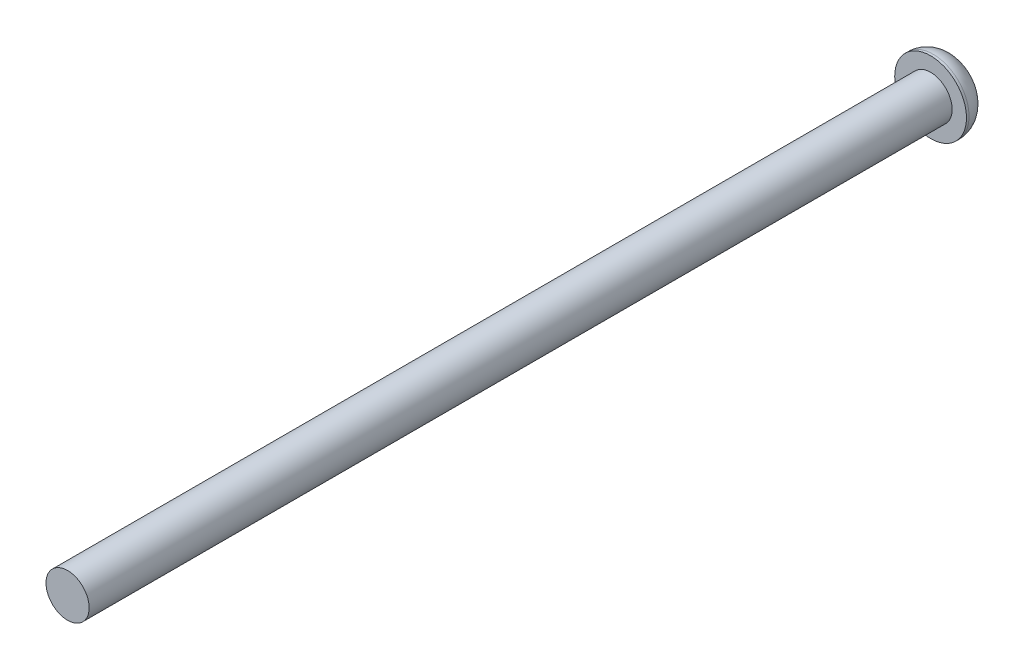
ISO-10303-21;
HEADER;
FILE_DESCRIPTION(('STEP AP214'),'2;1');
FILE_NAME('part.step','',(''),(''),'','','');
FILE_SCHEMA(('AUTOMOTIVE_DESIGN { 1 0 10303 214 1 1 1 1 }'));
ENDSEC;
DATA;
#1=APPLICATION_CONTEXT('core data for automotive mechanical design processes');
#2=APPLICATION_PROTOCOL_DEFINITION('international standard','automotive_design',2000,#1);
#3=PRODUCT_CONTEXT('',#1,'mechanical');
#4=PRODUCT('Part','Part','',(#3));
#5=PRODUCT_RELATED_PRODUCT_CATEGORY('part','',(#4));
#6=PRODUCT_DEFINITION_FORMATION('','',#4);
#7=PRODUCT_DEFINITION_CONTEXT('part definition',#1,'design');
#8=PRODUCT_DEFINITION('design','',#6,#7);
#9=PRODUCT_DEFINITION_SHAPE('','',#8);
#10=(LENGTH_UNIT() NAMED_UNIT(*) SI_UNIT(.MILLI.,.METRE.));
#11=(NAMED_UNIT(*) PLANE_ANGLE_UNIT() SI_UNIT($,.RADIAN.));
#12=(NAMED_UNIT(*) SI_UNIT($,.STERADIAN.) SOLID_ANGLE_UNIT());
#13=UNCERTAINTY_MEASURE_WITH_UNIT(LENGTH_MEASURE(1.E-05),#10,'distance_accuracy_value','');
#14=(GEOMETRIC_REPRESENTATION_CONTEXT(3) GLOBAL_UNCERTAINTY_ASSIGNED_CONTEXT((#13)) GLOBAL_UNIT_ASSIGNED_CONTEXT((#10,
#11,#12)) REPRESENTATION_CONTEXT('',''));
#15=CARTESIAN_POINT('',(0.,0.,0.));
#16=DIRECTION('',(0.,0.,1.));
#17=DIRECTION('',(1.,0.,0.));
#18=AXIS2_PLACEMENT_3D('',#15,#16,#17);
#19=CARTESIAN_POINT('',(0.,0.,100.));
#20=DIRECTION('',(0.,0.,-1.));
#21=DIRECTION('',(-1.,0.,0.));
#22=AXIS2_PLACEMENT_3D('',#19,#20,#21);
#23=CYLINDRICAL_SURFACE('',#22,2.5);
#24=CARTESIAN_POINT('',(0.,0.,100.));
#25=DIRECTION('',(0.,0.,1.));
#26=DIRECTION('',(1.,0.,0.));
#27=AXIS2_PLACEMENT_3D('',#24,#25,#26);
#28=CIRCLE('',#27,2.5);
#29=CARTESIAN_POINT('',(2.5,0.,100.));
#30=VERTEX_POINT('',#29);
#31=EDGE_CURVE('E146',#30,#30,#28,.T.);
#32=ORIENTED_EDGE('',*,*,#31,.F.);
#33=EDGE_LOOP('',(#32));
#34=FACE_BOUND('',#33,.T.);
#35=CARTESIAN_POINT('',(0.,0.,0.));
#36=DIRECTION('',(0.,0.,-1.));
#37=DIRECTION('',(-1.,0.,0.));
#38=AXIS2_PLACEMENT_3D('',#35,#36,#37);
#39=CIRCLE('',#38,2.5);
#40=CARTESIAN_POINT('',(-2.5,0.,0.));
#41=VERTEX_POINT('',#40);
#42=EDGE_CURVE('E143',#41,#41,#39,.T.);
#43=ORIENTED_EDGE('',*,*,#42,.F.);
#44=EDGE_LOOP('',(#43));
#45=FACE_BOUND('',#44,.T.);
#46=ADVANCED_FACE('F33',(#34,#45),#23,.T.);
#47=CARTESIAN_POINT('',(0.,0.,100.));
#48=DIRECTION('',(0.,0.,1.));
#49=DIRECTION('',(1.,0.,0.));
#50=AXIS2_PLACEMENT_3D('',#47,#48,#49);
#51=PLANE('',#50);
#52=ORIENTED_EDGE('',*,*,#31,.T.);
#53=EDGE_LOOP('',(#52));
#54=FACE_BOUND('',#53,.T.);
#55=ADVANCED_FACE('F167',(#54),#51,.T.);
#56=CARTESIAN_POINT('',(0.,0.,0.));
#57=DIRECTION('',(0.,0.,-1.));
#58=DIRECTION('',(-1.,0.,0.));
#59=AXIS2_PLACEMENT_3D('',#56,#57,#58);
#60=PLANE('',#59);
#61=CARTESIAN_POINT('',(0.,0.,0.));
#62=DIRECTION('',(0.,0.,-1.));
#63=DIRECTION('',(-1.,0.,0.));
#64=AXIS2_PLACEMENT_3D('',#61,#62,#63);
#65=CIRCLE('',#64,4.15958487677486);
#66=CARTESIAN_POINT('',(-4.15958487677486,0.,0.));
#67=VERTEX_POINT('',#66);
#68=EDGE_CURVE('E135',#67,#67,#65,.T.);
#69=ORIENTED_EDGE('',*,*,#68,.F.);
#70=EDGE_LOOP('',(#69));
#71=FACE_BOUND('',#70,.T.);
#72=ORIENTED_EDGE('',*,*,#42,.T.);
#73=EDGE_LOOP('',(#72));
#74=FACE_BOUND('',#73,.T.);
#75=ADVANCED_FACE('F172',(#71,#74),#60,.F.);
#76=CARTESIAN_POINT('',(0.,0.,-2.8));
#77=DIRECTION('',(0.,0.,1.));
#78=DIRECTION('',(1.,0.,0.));
#79=AXIS2_PLACEMENT_3D('',#76,#77,#78);
#80=CYLINDRICAL_SURFACE('',#79,4.15958487677486);
#81=CARTESIAN_POINT('',(0.,0.,-0.3));
#82=DIRECTION('',(0.,0.,-1.));
#83=DIRECTION('',(-1.,0.,0.));
#84=AXIS2_PLACEMENT_3D('',#81,#82,#83);
#85=CIRCLE('',#84,4.15958487677486);
#86=CARTESIAN_POINT('',(-4.15958487677486,0.,-0.3));
#87=VERTEX_POINT('',#86);
#88=EDGE_CURVE('E11',#87,#87,#85,.F.);
#89=ORIENTED_EDGE('',*,*,#88,.T.);
#90=EDGE_LOOP('',(#89));
#91=FACE_BOUND('',#90,.T.);
#92=ORIENTED_EDGE('',*,*,#68,.T.);
#93=EDGE_LOOP('',(#92));
#94=FACE_BOUND('',#93,.T.);
#95=ADVANCED_FACE('F162',(#91,#94),#80,.T.);
#96=CARTESIAN_POINT('',(0.,0.,-2.8));
#97=DIRECTION('',(0.,0.,-1.));
#98=DIRECTION('',(-1.,0.,0.));
#99=AXIS2_PLACEMENT_3D('',#96,#97,#98);
#100=PLANE('',#99);
#101=DIRECTION('',(-0.814788791019046,0.579757902947188,0.));
#102=VECTOR('',#101,1.);
#103=CARTESIAN_POINT('',(-0.144973678126217,-1.52414450415627,-2.8));
#104=LINE('',#103,#102);
#105=CARTESIAN_POINT('',(-0.144973678126217,-1.52414450415627,-2.8));
#106=VERTEX_POINT('',#105);
#107=CARTESIAN_POINT('',(-1.39243469870088,-0.636521363940765,-2.8));
#108=VERTEX_POINT('',#107);
#109=EDGE_CURVE('E48',#106,#108,#104,.T.);
#110=ORIENTED_EDGE('',*,*,#109,.F.);
#111=DIRECTION('',(-0.909479467506581,-0.415748840267711,0.));
#112=VECTOR('',#111,1.);
#113=CARTESIAN_POINT('',(1.24746102057466,-0.887623140215509,-2.8));
#114=LINE('',#113,#112);
#115=CARTESIAN_POINT('',(1.24746102057466,-0.887623140215509,-2.8));
#116=VERTEX_POINT('',#115);
#117=EDGE_CURVE('E131',#116,#106,#114,.T.);
#118=ORIENTED_EDGE('',*,*,#117,.F.);
#119=DIRECTION('',(-0.0946906764875342,-0.995506743214898,0.));
#120=VECTOR('',#119,1.);
#121=CARTESIAN_POINT('',(1.39243469870088,0.636521363940765,-2.8));
#122=LINE('',#121,#120);
#123=CARTESIAN_POINT('',(1.39243469870088,0.636521363940765,-2.8));
#124=VERTEX_POINT('',#123);
#125=EDGE_CURVE('E129',#124,#116,#122,.T.);
#126=ORIENTED_EDGE('',*,*,#125,.F.);
#127=DIRECTION('',(0.814788791019046,-0.579757902947188,0.));
#128=VECTOR('',#127,1.);
#129=CARTESIAN_POINT('',(0.144973678126217,1.52414450415627,-2.8));
#130=LINE('',#129,#128);
#131=CARTESIAN_POINT('',(0.144973678126217,1.52414450415627,-2.8));
#132=VERTEX_POINT('',#131);
#133=EDGE_CURVE('E96',#132,#124,#130,.T.);
#134=ORIENTED_EDGE('',*,*,#133,.F.);
#135=DIRECTION('',(0.909479467506581,0.41574884026771,0.));
#136=VECTOR('',#135,1.);
#137=CARTESIAN_POINT('',(-1.24746102057466,0.88762314021551,-2.8));
#138=LINE('',#137,#136);
#139=CARTESIAN_POINT('',(-1.24746102057466,0.88762314021551,-2.8));
#140=VERTEX_POINT('',#139);
#141=EDGE_CURVE('E125',#140,#132,#138,.T.);
#142=ORIENTED_EDGE('',*,*,#141,.F.);
#143=DIRECTION('',(0.0946906764875343,0.995506743214898,0.));
#144=VECTOR('',#143,1.);
#145=CARTESIAN_POINT('',(-1.39243469870088,-0.636521363940765,-2.8));
#146=LINE('',#145,#144);
#147=EDGE_CURVE('E122',#108,#140,#146,.T.);
#148=ORIENTED_EDGE('',*,*,#147,.F.);
#149=EDGE_LOOP('',(#110,#118,#126,#134,#142,#148));
#150=FACE_BOUND('',#149,.T.);
#151=CARTESIAN_POINT('',(0.,0.,-2.8));
#152=DIRECTION('',(0.,0.,-1.));
#153=DIRECTION('',(-1.,0.,0.));
#154=AXIS2_PLACEMENT_3D('',#151,#152,#153);
#155=CIRCLE('',#154,1.65958487677486);
#156=CARTESIAN_POINT('',(-1.65958487677486,0.,-2.8));
#157=VERTEX_POINT('',#156);
#158=EDGE_CURVE('E41',#157,#157,#155,.T.);
#159=ORIENTED_EDGE('',*,*,#158,.T.);
#160=EDGE_LOOP('',(#159));
#161=FACE_BOUND('',#160,.T.);
#162=ADVANCED_FACE('F151',(#150,#161),#100,.T.);
#163=CARTESIAN_POINT('',(0.,0.,-0.3));
#164=DIRECTION('',(0.,0.,-1.));
#165=DIRECTION('',(-1.,0.,0.));
#166=AXIS2_PLACEMENT_3D('',#163,#164,#165);
#167=DEGENERATE_TOROIDAL_SURFACE('',#166,1.65958487677486,2.5,.T.);
#168=ORIENTED_EDGE('',*,*,#88,.F.);
#169=EDGE_LOOP('',(#168));
#170=FACE_BOUND('',#169,.T.);
#171=ORIENTED_EDGE('',*,*,#158,.F.);
#172=EDGE_LOOP('',(#171));
#173=FACE_BOUND('',#172,.T.);
#174=ADVANCED_FACE('F35',(#170,#173),#167,.T.);
#175=CARTESIAN_POINT('',(-0.144973678126217,-1.52414450415627,-0.8));
#176=DIRECTION('',(-0.579757902947188,-0.814788791019046,0.));
#177=DIRECTION('',(0.814788791019046,-0.579757902947188,0.));
#178=AXIS2_PLACEMENT_3D('',#175,#176,#177);
#179=PLANE('',#178);
#180=ORIENTED_EDGE('',*,*,#109,.T.);
#181=DIRECTION('',(0.,0.,-1.));
#182=VECTOR('',#181,1.);
#183=CARTESIAN_POINT('',(-1.39243469870088,-0.636521363940765,-0.8));
#184=LINE('',#183,#182);
#185=CARTESIAN_POINT('',(-1.39243469870088,-0.636521363940765,-0.8));
#186=VERTEX_POINT('',#185);
#187=EDGE_CURVE('E78',#186,#108,#184,.T.);
#188=ORIENTED_EDGE('',*,*,#187,.F.);
#189=DIRECTION('',(-0.814788791019046,0.579757902947188,0.));
#190=VECTOR('',#189,1.);
#191=CARTESIAN_POINT('',(-0.144973678126217,-1.52414450415627,-0.8));
#192=LINE('',#191,#190);
#193=CARTESIAN_POINT('',(-0.144973678126217,-1.52414450415627,-0.8));
#194=VERTEX_POINT('',#193);
#195=EDGE_CURVE('E133',#194,#186,#192,.T.);
#196=ORIENTED_EDGE('',*,*,#195,.F.);
#197=DIRECTION('',(0.,0.,-1.));
#198=VECTOR('',#197,1.);
#199=CARTESIAN_POINT('',(-0.144973678126217,-1.52414450415627,-0.8));
#200=LINE('',#199,#198);
#201=EDGE_CURVE('E56',#194,#106,#200,.T.);
#202=ORIENTED_EDGE('',*,*,#201,.T.);
#203=EDGE_LOOP('',(#180,#188,#196,#202));
#204=FACE_BOUND('',#203,.T.);
#205=ADVANCED_FACE('F154',(#204),#179,.F.);
#206=CARTESIAN_POINT('',(1.24746102057466,-0.887623140215509,-0.8));
#207=DIRECTION('',(0.415748840267711,-0.909479467506581,0.));
#208=DIRECTION('',(0.909479467506581,0.415748840267711,0.));
#209=AXIS2_PLACEMENT_3D('',#206,#207,#208);
#210=PLANE('',#209);
#211=ORIENTED_EDGE('',*,*,#117,.T.);
#212=ORIENTED_EDGE('',*,*,#201,.F.);
#213=DIRECTION('',(-0.909479467506581,-0.415748840267711,0.));
#214=VECTOR('',#213,1.);
#215=CARTESIAN_POINT('',(1.24746102057466,-0.887623140215509,-0.8));
#216=LINE('',#215,#214);
#217=CARTESIAN_POINT('',(1.24746102057466,-0.887623140215509,-0.8));
#218=VERTEX_POINT('',#217);
#219=EDGE_CURVE('E108',#218,#194,#216,.T.);
#220=ORIENTED_EDGE('',*,*,#219,.F.);
#221=DIRECTION('',(0.,0.,-1.));
#222=VECTOR('',#221,1.);
#223=CARTESIAN_POINT('',(1.24746102057466,-0.887623140215509,-0.8));
#224=LINE('',#223,#222);
#225=EDGE_CURVE('E100',#218,#116,#224,.T.);
#226=ORIENTED_EDGE('',*,*,#225,.T.);
#227=EDGE_LOOP('',(#211,#212,#220,#226));
#228=FACE_BOUND('',#227,.T.);
#229=ADVANCED_FACE('F160',(#228),#210,.F.);
#230=CARTESIAN_POINT('',(1.39243469870088,0.636521363940765,-0.8));
#231=DIRECTION('',(0.995506743214898,-0.0946906764875343,0.));
#232=DIRECTION('',(0.0946906764875343,0.995506743214898,0.));
#233=AXIS2_PLACEMENT_3D('',#230,#231,#232);
#234=PLANE('',#233);
#235=ORIENTED_EDGE('',*,*,#125,.T.);
#236=ORIENTED_EDGE('',*,*,#225,.F.);
#237=DIRECTION('',(-0.0946906764875342,-0.995506743214898,0.));
#238=VECTOR('',#237,1.);
#239=CARTESIAN_POINT('',(1.39243469870088,0.636521363940765,-0.8));
#240=LINE('',#239,#238);
#241=CARTESIAN_POINT('',(1.39243469870088,0.636521363940765,-0.8));
#242=VERTEX_POINT('',#241);
#243=EDGE_CURVE('E104',#242,#218,#240,.T.);
#244=ORIENTED_EDGE('',*,*,#243,.F.);
#245=DIRECTION('',(0.,0.,-1.));
#246=VECTOR('',#245,1.);
#247=CARTESIAN_POINT('',(1.39243469870088,0.636521363940765,-0.8));
#248=LINE('',#247,#246);
#249=EDGE_CURVE('E89',#242,#124,#248,.T.);
#250=ORIENTED_EDGE('',*,*,#249,.T.);
#251=EDGE_LOOP('',(#235,#236,#244,#250));
#252=FACE_BOUND('',#251,.T.);
#253=ADVANCED_FACE('F105',(#252),#234,.F.);
#254=CARTESIAN_POINT('',(0.144973678126217,1.52414450415627,-0.8));
#255=DIRECTION('',(0.579757902947188,0.814788791019046,0.));
#256=DIRECTION('',(-0.814788791019047,0.579757902947188,0.));
#257=AXIS2_PLACEMENT_3D('',#254,#255,#256);
#258=PLANE('',#257);
#259=ORIENTED_EDGE('',*,*,#133,.T.);
#260=ORIENTED_EDGE('',*,*,#249,.F.);
#261=DIRECTION('',(0.814788791019046,-0.579757902947188,0.));
#262=VECTOR('',#261,1.);
#263=CARTESIAN_POINT('',(0.144973678126217,1.52414450415627,-0.8));
#264=LINE('',#263,#262);
#265=CARTESIAN_POINT('',(0.144973678126217,1.52414450415627,-0.8));
#266=VERTEX_POINT('',#265);
#267=EDGE_CURVE('E93',#266,#242,#264,.T.);
#268=ORIENTED_EDGE('',*,*,#267,.F.);
#269=DIRECTION('',(0.,0.,-1.));
#270=VECTOR('',#269,1.);
#271=CARTESIAN_POINT('',(0.144973678126217,1.52414450415627,-0.8));
#272=LINE('',#271,#270);
#273=EDGE_CURVE('E101',#266,#132,#272,.T.);
#274=ORIENTED_EDGE('',*,*,#273,.T.);
#275=EDGE_LOOP('',(#259,#260,#268,#274));
#276=FACE_BOUND('',#275,.T.);
#277=ADVANCED_FACE('F91',(#276),#258,.F.);
#278=CARTESIAN_POINT('',(-1.24746102057466,0.88762314021551,-0.8));
#279=DIRECTION('',(-0.41574884026771,0.909479467506581,0.));
#280=DIRECTION('',(-0.909479467506581,-0.41574884026771,0.));
#281=AXIS2_PLACEMENT_3D('',#278,#279,#280);
#282=PLANE('',#281);
#283=ORIENTED_EDGE('',*,*,#141,.T.);
#284=ORIENTED_EDGE('',*,*,#273,.F.);
#285=DIRECTION('',(0.909479467506581,0.41574884026771,0.));
#286=VECTOR('',#285,1.);
#287=CARTESIAN_POINT('',(-1.24746102057466,0.88762314021551,-0.8));
#288=LINE('',#287,#286);
#289=CARTESIAN_POINT('',(-1.24746102057466,0.88762314021551,-0.8));
#290=VERTEX_POINT('',#289);
#291=EDGE_CURVE('E114',#290,#266,#288,.T.);
#292=ORIENTED_EDGE('',*,*,#291,.F.);
#293=DIRECTION('',(0.,0.,-1.));
#294=VECTOR('',#293,1.);
#295=CARTESIAN_POINT('',(-1.24746102057466,0.88762314021551,-0.8));
#296=LINE('',#295,#294);
#297=EDGE_CURVE('E138',#290,#140,#296,.T.);
#298=ORIENTED_EDGE('',*,*,#297,.T.);
#299=EDGE_LOOP('',(#283,#284,#292,#298));
#300=FACE_BOUND('',#299,.T.);
#301=ADVANCED_FACE('F187',(#300),#282,.F.);
#302=CARTESIAN_POINT('',(-1.39243469870088,-0.636521363940765,-0.8));
#303=DIRECTION('',(-0.995506743214898,0.0946906764875343,0.));
#304=DIRECTION('',(-0.0946906764875343,-0.995506743214898,0.));
#305=AXIS2_PLACEMENT_3D('',#302,#303,#304);
#306=PLANE('',#305);
#307=ORIENTED_EDGE('',*,*,#147,.T.);
#308=ORIENTED_EDGE('',*,*,#297,.F.);
#309=DIRECTION('',(0.0946906764875343,0.995506743214898,0.));
#310=VECTOR('',#309,1.);
#311=CARTESIAN_POINT('',(-1.39243469870088,-0.636521363940765,-0.8));
#312=LINE('',#311,#310);
#313=EDGE_CURVE('E116',#186,#290,#312,.T.);
#314=ORIENTED_EDGE('',*,*,#313,.F.);
#315=ORIENTED_EDGE('',*,*,#187,.T.);
#316=EDGE_LOOP('',(#307,#308,#314,#315));
#317=FACE_BOUND('',#316,.T.);
#318=ADVANCED_FACE('F184',(#317),#306,.F.);
#319=CARTESIAN_POINT('',(0.,0.,-0.8));
#320=DIRECTION('',(0.,0.,-1.));
#321=DIRECTION('',(-1.,0.,0.));
#322=AXIS2_PLACEMENT_3D('',#319,#320,#321);
#323=PLANE('',#322);
#324=ORIENTED_EDGE('',*,*,#195,.T.);
#325=ORIENTED_EDGE('',*,*,#313,.T.);
#326=ORIENTED_EDGE('',*,*,#291,.T.);
#327=ORIENTED_EDGE('',*,*,#267,.T.);
#328=ORIENTED_EDGE('',*,*,#243,.T.);
#329=ORIENTED_EDGE('',*,*,#219,.T.);
#330=EDGE_LOOP('',(#324,#325,#326,#327,#328,#329));
#331=FACE_BOUND('',#330,.T.);
#332=ADVANCED_FACE('F111',(#331),#323,.T.);
#333=CLOSED_SHELL('',(#46,#55,#75,#95,#162,#174,#205,#229,#253,#277,#301,#318,#332));
#334=MANIFOLD_SOLID_BREP('B2',#333);
#335=ADVANCED_BREP_SHAPE_REPRESENTATION('',(#18,#334),#14);
#336=SHAPE_DEFINITION_REPRESENTATION(#9,#335);
ENDSEC;
END-ISO-10303-21;
